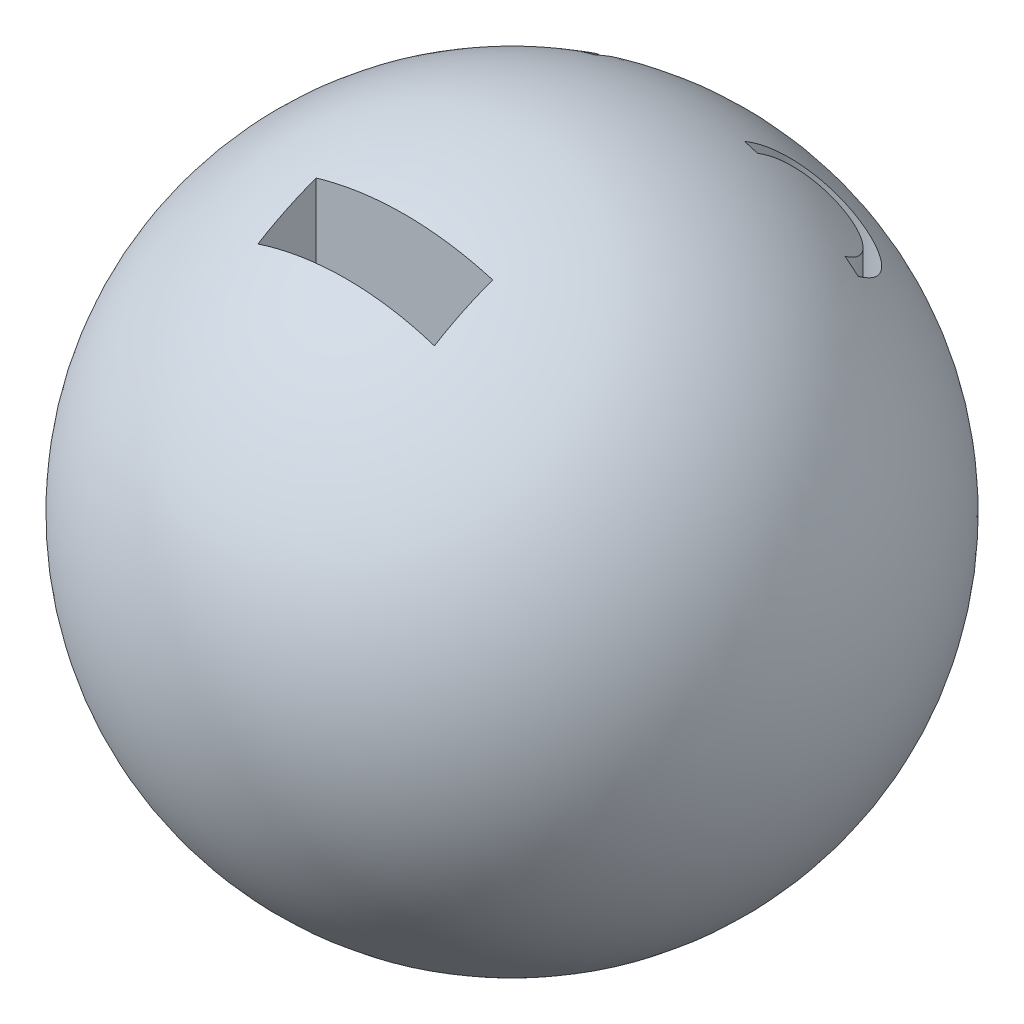
ISO-10303-21;
HEADER;
FILE_DESCRIPTION(('STEP AP214'),'2;1');
FILE_NAME('part.step','',(''),(''),'','','');
FILE_SCHEMA(('AUTOMOTIVE_DESIGN { 1 0 10303 214 1 1 1 1 }'));
ENDSEC;
DATA;
#1=APPLICATION_CONTEXT('core data for automotive mechanical design processes');
#2=APPLICATION_PROTOCOL_DEFINITION('international standard','automotive_design',2000,#1);
#3=PRODUCT_CONTEXT('',#1,'mechanical');
#4=PRODUCT('Part','Part','',(#3));
#5=PRODUCT_RELATED_PRODUCT_CATEGORY('part','',(#4));
#6=PRODUCT_DEFINITION_FORMATION('','',#4);
#7=PRODUCT_DEFINITION_CONTEXT('part definition',#1,'design');
#8=PRODUCT_DEFINITION('design','',#6,#7);
#9=PRODUCT_DEFINITION_SHAPE('','',#8);
#10=(LENGTH_UNIT() NAMED_UNIT(*) SI_UNIT(.MILLI.,.METRE.));
#11=(NAMED_UNIT(*) PLANE_ANGLE_UNIT() SI_UNIT($,.RADIAN.));
#12=(NAMED_UNIT(*) SI_UNIT($,.STERADIAN.) SOLID_ANGLE_UNIT());
#13=UNCERTAINTY_MEASURE_WITH_UNIT(LENGTH_MEASURE(1.E-05),#10,'distance_accuracy_value','');
#14=(GEOMETRIC_REPRESENTATION_CONTEXT(3) GLOBAL_UNCERTAINTY_ASSIGNED_CONTEXT((#13)) GLOBAL_UNIT_ASSIGNED_CONTEXT((#10,
#11,#12)) REPRESENTATION_CONTEXT('',''));
#15=CARTESIAN_POINT('',(0.,0.,0.));
#16=DIRECTION('',(0.,0.,1.));
#17=DIRECTION('',(1.,0.,0.));
#18=AXIS2_PLACEMENT_3D('',#15,#16,#17);
#19=CARTESIAN_POINT('',(0.,25.,-11.940688040506));
#20=DIRECTION('',(0.,0.,-1.));
#21=DIRECTION('',(-1.,0.,0.));
#22=AXIS2_PLACEMENT_3D('',#19,#20,#21);
#23=PLANE('',#22);
#24=CARTESIAN_POINT('',(0.,0.,-11.940688040506));
#25=DIRECTION('',(0.,0.,-1.));
#26=DIRECTION('',(-1.,0.,0.));
#27=AXIS2_PLACEMENT_3D('',#24,#25,#26);
#28=CIRCLE('',#27,21.9640608522039);
#29=CARTESIAN_POINT('',(-14.3088925597589,16.663599936166,-11.940688040506));
#30=VERTEX_POINT('',#29);
#31=CARTESIAN_POINT('',(-13.3088925597589,17.4726457055625,-11.940688040506));
#32=VERTEX_POINT('',#31);
#33=EDGE_CURVE('E248',#30,#32,#28,.T.);
#34=ORIENTED_EDGE('',*,*,#33,.T.);
#35=DIRECTION('',(0.,-1.,0.));
#36=VECTOR('',#35,1.);
#37=CARTESIAN_POINT('',(-13.3088925597589,25.,-11.940688040506));
#38=LINE('',#37,#36);
#39=CARTESIAN_POINT('',(-13.3088925597589,10.,-11.940688040506));
#40=VERTEX_POINT('',#39);
#41=EDGE_CURVE('E212',#32,#40,#38,.T.);
#42=ORIENTED_EDGE('',*,*,#41,.T.);
#43=DIRECTION('',(1.,0.,0.));
#44=VECTOR('',#43,1.);
#45=CARTESIAN_POINT('',(0.,10.,-11.940688040506));
#46=LINE('',#45,#44);
#47=CARTESIAN_POINT('',(-14.3088925597589,10.,-11.940688040506));
#48=VERTEX_POINT('',#47);
#49=EDGE_CURVE('E155',#48,#40,#46,.T.);
#50=ORIENTED_EDGE('',*,*,#49,.F.);
#51=DIRECTION('',(0.,-1.,0.));
#52=VECTOR('',#51,1.);
#53=CARTESIAN_POINT('',(-14.3088925597589,25.,-11.940688040506));
#54=LINE('',#53,#52);
#55=EDGE_CURVE('E203',#30,#48,#54,.T.);
#56=ORIENTED_EDGE('',*,*,#55,.F.);
#57=EDGE_LOOP('',(#34,#42,#50,#56));
#58=FACE_BOUND('',#57,.T.);
#59=ADVANCED_FACE('F41',(#58),#23,.T.);
#60=CARTESIAN_POINT('',(-10.,25.,-11.940688040506));
#61=DIRECTION('',(0.,-1.,0.));
#62=DIRECTION('',(0.,0.,-1.));
#63=AXIS2_PLACEMENT_3D('',#60,#61,#62);
#64=CYLINDRICAL_SURFACE('',#63,3.3088925597589);
#65=CARTESIAN_POINT('',(-13.3088925537146,17.4727823871361,-11.9404880405061));
#66=CARTESIAN_POINT('',(-13.3088947361778,17.3562982098298,-12.1110222158404));
#67=CARTESIAN_POINT('',(-13.295704320917,17.2435619511227,-12.2852437985623));
#68=CARTESIAN_POINT('',(-13.2394840224336,17.0302466642146,-12.6384360645772));
#69=CARTESIAN_POINT('',(-13.1961747792395,16.9297918919905,-12.8174359969134));
#70=CARTESIAN_POINT('',(-13.0895534966639,16.7684106575193,-13.1343223187967));
#71=CARTESIAN_POINT('',(-13.0328757781544,16.7036676011026,-13.2724558375451));
#72=CARTESIAN_POINT('',(-12.8982481827764,16.5894970095622,-13.5443672620063));
#73=CARTESIAN_POINT('',(-12.8203655096168,16.540022125232,-13.6781574582544));
#74=CARTESIAN_POINT('',(-12.6872575039146,16.4797090616698,-13.872974060352));
#75=CARTESIAN_POINT('',(-12.6398543961017,16.4618596597068,-13.9372865489046));
#76=CARTESIAN_POINT('',(-12.5398587387273,16.4313683313452,-14.0630277135499));
#77=CARTESIAN_POINT('',(-12.4872689564581,16.4187236464608,-14.1244579019176));
#78=CARTESIAN_POINT('',(-12.3772270928151,16.3989696794622,-14.2437609526624));
#79=CARTESIAN_POINT('',(-12.3197750137572,16.3918603947113,-14.301633816734));
#80=CARTESIAN_POINT('',(-12.2005439741761,16.3833642470615,-14.4131464612956));
#81=CARTESIAN_POINT('',(-12.1387656725367,16.3819765146893,-14.4667868837516));
#82=CARTESIAN_POINT('',(-11.966448721888,16.3860567160445,-14.6055012122972));
#83=CARTESIAN_POINT('',(-11.8522803651384,16.3970570341724,-14.6860278827862));
#84=CARTESIAN_POINT('',(-11.6167880604062,16.4350539299512,-14.8310064694556));
#85=CARTESIAN_POINT('',(-11.4954639585343,16.4620508517337,-14.8954580397735));
#86=CARTESIAN_POINT('',(-11.2494767139356,16.5300110605877,-15.0075773367666));
#87=CARTESIAN_POINT('',(-11.1248218267965,16.5709423209933,-15.0552830458999));
#88=CARTESIAN_POINT('',(-10.8748148231284,16.6644368375098,-15.1345423843198));
#89=CARTESIAN_POINT('',(-10.7494623991202,16.7170056982645,-15.1660882066973));
#90=CARTESIAN_POINT('',(-10.4399301862444,16.8591669441455,-15.2256004361577));
#91=CARTESIAN_POINT('',(-10.2565690905799,16.9543803913237,-15.244484726608));
#92=CARTESIAN_POINT('',(-9.89726165829825,17.1591556451927,-15.2528883755337));
#93=CARTESIAN_POINT('',(-9.72133400780289,17.2687510622635,-15.2423377372067));
#94=CARTESIAN_POINT('',(-9.32622319277673,17.5332646935089,-15.1881463828031));
#95=CARTESIAN_POINT('',(-9.11064749460463,17.6916628954194,-15.1352175041833));
#96=CARTESIAN_POINT('',(-8.70038824613922,18.0176024646388,-14.9914380255558));
#97=CARTESIAN_POINT('',(-8.50571326598141,18.1851475403785,-14.9005719438615));
#98=CARTESIAN_POINT('',(-8.1370950222696,18.5269879186247,-14.6838168391881));
#99=CARTESIAN_POINT('',(-7.96351915513039,18.7013475551907,-14.5574076527589));
#100=CARTESIAN_POINT('',(-7.64365810131562,19.0503793758628,-14.2735328762265));
#101=CARTESIAN_POINT('',(-7.49739928543092,19.2250516993152,-14.1160375753453));
#102=CARTESIAN_POINT('',(-7.29400652147932,19.4944142931375,-13.8487971659073));
#103=CARTESIAN_POINT('',(-7.22598081294592,19.5904661858287,-13.7485502114371));
#104=CARTESIAN_POINT('',(-7.10066620453465,19.7806874260756,-13.5398987832321));
#105=CARTESIAN_POINT('',(-7.04338003311252,19.8748562898206,-13.4314922462749));
#106=CARTESIAN_POINT('',(-6.88942594455563,20.1528888251704,-13.0954685826447));
#107=CARTESIAN_POINT('',(-6.81001689165659,20.3331239359121,-12.8562119637034));
#108=CARTESIAN_POINT('',(-6.73662317202196,20.5772588165031,-12.4984695645343));
#109=CARTESIAN_POINT('',(-6.71976261581063,20.6486425030631,-12.3893366739656));
#110=CARTESIAN_POINT('',(-6.69700991229434,20.7874992694493,-12.1674621792254));
#111=CARTESIAN_POINT('',(-6.69112126007247,20.8549710965296,-12.0547194367704));
#112=CARTESIAN_POINT('',(-6.69110744628541,20.9201774967804,-11.940488040506));
#113=B_SPLINE_CURVE_WITH_KNOTS('',3,(#65,#66,#67,#68,#69,#70,#71,#72,#73,#74,#75,#76,#77,#78,
#79,#80,#81,#82,#83,#84,#85,#86,#87,#88,#89,#90,#91,#92,#93,#94,#95,#96,#97,#98,#99,#100,#101,
#102,#103,#104,#105,#106,#107,#108,#109,#110,#111,#112),.UNSPECIFIED.,.F.,.F.,(4,2,2,2,2,2,2,2,
2,2,2,2,2,2,2,2,2,2,2,2,2,2,2,4),(0.,0.620581022945615,1.24699623056297,1.73340283671913,
2.21828549261167,2.46355776347541,2.7086998727995,2.9538418653585,3.19894660364176,
3.61711164635238,4.03528568528253,4.45250501081032,4.86992570710641,5.48888661845468,
6.10932068400792,6.9231218757535,7.73725549445044,8.56398640652153,9.39151133252363,
9.85476913465211,10.3181444716936,11.2408903894361,11.6349047379844,12.0290445777515),.UNSPECIFIED.);
#114=CARTESIAN_POINT('',(-6.69110744024109,20.9200633446093,-11.940688040506));
#115=VERTEX_POINT('',#114);
#116=EDGE_CURVE('E241',#32,#115,#113,.T.);
#117=ORIENTED_EDGE('',*,*,#116,.T.);
#118=DIRECTION('',(0.,-1.,0.));
#119=VECTOR('',#118,1.);
#120=CARTESIAN_POINT('',(-6.69110744024109,25.,-11.940688040506));
#121=LINE('',#120,#119);
#122=CARTESIAN_POINT('',(-6.69110744024109,10.,-11.940688040506));
#123=VERTEX_POINT('',#122);
#124=EDGE_CURVE('E209',#115,#123,#121,.T.);
#125=ORIENTED_EDGE('',*,*,#124,.T.);
#126=CARTESIAN_POINT('',(-10.,10.,-11.940688040506));
#127=DIRECTION('',(0.,1.,0.));
#128=DIRECTION('',(0.,0.,1.));
#129=AXIS2_PLACEMENT_3D('',#126,#127,#128);
#130=CIRCLE('',#129,3.3088925597589);
#131=EDGE_CURVE('E161',#40,#123,#130,.F.);
#132=ORIENTED_EDGE('',*,*,#131,.F.);
#133=ORIENTED_EDGE('',*,*,#41,.F.);
#134=EDGE_LOOP('',(#117,#125,#132,#133));
#135=FACE_BOUND('',#134,.T.);
#136=ADVANCED_FACE('F236',(#135),#64,.T.);
#137=CARTESIAN_POINT('',(0.,25.,-11.940688040506));
#138=DIRECTION('',(0.,0.,1.));
#139=DIRECTION('',(1.,0.,0.));
#140=AXIS2_PLACEMENT_3D('',#137,#138,#139);
#141=PLANE('',#140);
#142=DIRECTION('',(0.,-1.,0.));
#143=VECTOR('',#142,1.);
#144=CARTESIAN_POINT('',(-5.69110744024109,25.,-11.940688040506));
#145=LINE('',#144,#143);
#146=CARTESIAN_POINT('',(-5.69110744024109,21.2139403511688,-11.940688040506));
#147=VERTEX_POINT('',#146);
#148=CARTESIAN_POINT('',(-5.69110744024109,10.,-11.940688040506));
#149=VERTEX_POINT('',#148);
#150=EDGE_CURVE('E206',#147,#149,#145,.T.);
#151=ORIENTED_EDGE('',*,*,#150,.T.);
#152=DIRECTION('',(-1.,0.,0.));
#153=VECTOR('',#152,1.);
#154=CARTESIAN_POINT('',(0.,10.,-11.940688040506));
#155=LINE('',#154,#153);
#156=EDGE_CURVE('E195',#149,#123,#155,.T.);
#157=ORIENTED_EDGE('',*,*,#156,.T.);
#158=ORIENTED_EDGE('',*,*,#124,.F.);
#159=CARTESIAN_POINT('',(0.,0.,-11.940688040506));
#160=DIRECTION('',(0.,0.,1.));
#161=DIRECTION('',(1.,0.,0.));
#162=AXIS2_PLACEMENT_3D('',#159,#160,#161);
#163=CIRCLE('',#162,21.9640608522039);
#164=EDGE_CURVE('E223',#147,#115,#163,.T.);
#165=ORIENTED_EDGE('',*,*,#164,.F.);
#166=EDGE_LOOP('',(#151,#157,#158,#165));
#167=FACE_BOUND('',#166,.T.);
#168=ADVANCED_FACE('F231',(#167),#141,.F.);
#169=CARTESIAN_POINT('',(-10.,25.,-11.940688040506));
#170=DIRECTION('',(0.,-1.,0.));
#171=DIRECTION('',(0.,0.,-1.));
#172=AXIS2_PLACEMENT_3D('',#169,#170,#171);
#173=CYLINDRICAL_SURFACE('',#172,4.30889255975891);
#174=CARTESIAN_POINT('',(-5.69110744488266,21.214052922658,-11.940488040506));
#175=CARTESIAN_POINT('',(-5.69112160580676,21.1232128573604,-12.1018718422695));
#176=CARTESIAN_POINT('',(-5.7001573811218,21.0288061804851,-12.2609835644087));
#177=CARTESIAN_POINT('',(-5.73490808118444,20.8340108438783,-12.5733440622445));
#178=CARTESIAN_POINT('',(-5.76060009682489,20.7336305722401,-12.7266005850922));
#179=CARTESIAN_POINT('',(-5.86011492535645,20.4265428693245,-13.1738220832015));
#180=CARTESIAN_POINT('',(-5.95642281529891,20.2123724134185,-13.457907133213));
#181=CARTESIAN_POINT('',(-6.18550474194812,19.7969859531686,-13.9615478196891));
#182=CARTESIAN_POINT('',(-6.31285192974821,19.5970876244117,-14.1847677378886));
#183=CARTESIAN_POINT('',(-6.60189318072495,19.1910110170432,-14.6022564661009));
#184=CARTESIAN_POINT('',(-6.76365449011399,18.9848211302065,-14.796467308189));
#185=CARTESIAN_POINT('',(-7.15130407535014,18.5297514148325,-15.1874417264897));
#186=CARTESIAN_POINT('',(-7.38354576153136,18.280374549844,-15.3773432086696));
#187=CARTESIAN_POINT('',(-7.88461016466431,17.784520315667,-15.7065235545689));
#188=CARTESIAN_POINT('',(-8.15343272312807,17.5380429339214,-15.8458026376021));
#189=CARTESIAN_POINT('',(-8.55794707478728,17.1955710091532,-16.0031535784751));
#190=CARTESIAN_POINT('',(-8.6808635537406,17.0948776487073,-16.0447711963731));
#191=CARTESIAN_POINT('',(-8.93198980075096,16.8962530153711,-16.1171695549907));
#192=CARTESIAN_POINT('',(-9.06019972296271,16.7983218230601,-16.1479499798626));
#193=CARTESIAN_POINT('',(-9.45195331966465,16.510216544598,-16.222837939047));
#194=CARTESIAN_POINT('',(-9.72316146283604,16.3252678679447,-16.2497079256628));
#195=CARTESIAN_POINT('',(-10.2029206364221,16.0284298869716,-16.2494880558523));
#196=CARTESIAN_POINT('',(-10.4078146911034,15.9105628609248,-16.2353733462315));
#197=CARTESIAN_POINT('',(-10.82274531702,15.6932353025385,-16.175477674991));
#198=CARTESIAN_POINT('',(-11.0327738267289,15.5937477811044,-16.1297436202794));
#199=CARTESIAN_POINT('',(-11.4108423953104,15.4376641308241,-16.0158286120584));
#200=CARTESIAN_POINT('',(-11.578845660906,15.3764668393038,-15.9539986273912));
#201=CARTESIAN_POINT('',(-11.8276994040755,15.2999426124301,-15.8438060236446));
#202=CARTESIAN_POINT('',(-11.910139402595,15.2769771794901,-15.8041588762536));
#203=CARTESIAN_POINT('',(-12.0733552438296,15.2365888141592,-15.7190750141773));
#204=CARTESIAN_POINT('',(-12.1541317942374,15.2191634772602,-15.6736408232056));
#205=CARTESIAN_POINT('',(-12.3139039743118,15.1901473293927,-15.5767838516283));
#206=CARTESIAN_POINT('',(-12.3928831199409,15.1785983381788,-15.5253212678017));
#207=CARTESIAN_POINT('',(-12.5477000452489,15.1618112520408,-15.4169937278286));
#208=CARTESIAN_POINT('',(-12.6235392082053,15.156570348984,-15.3601311877195));
#209=CARTESIAN_POINT('',(-12.7714066085901,15.1525317663278,-15.2414219742566));
#210=CARTESIAN_POINT('',(-12.8434346654258,15.1537343917856,-15.1795750650635));
#211=CARTESIAN_POINT('',(-12.9830222278163,15.1625400323031,-15.051495531072));
#212=CARTESIAN_POINT('',(-13.0505819837297,15.1701426884418,-14.9852631524078));
#213=CARTESIAN_POINT('',(-13.2326044850222,15.2001307949331,-14.7947006988857));
#214=CARTESIAN_POINT('',(-13.3415788283919,15.2294669015372,-14.6661034298615));
#215=CARTESIAN_POINT('',(-13.5415089187139,15.3060336614409,-14.4007642827401));
#216=CARTESIAN_POINT('',(-13.6324623764455,15.3532665859839,-14.2640213727558));
#217=CARTESIAN_POINT('',(-13.8242670766582,15.4815721294379,-13.9378246249311));
#218=CARTESIAN_POINT('',(-13.9177584031864,15.5686962907881,-13.74642116062));
#219=CARTESIAN_POINT('',(-14.073512171116,15.7632286108588,-13.3607597195509));
#220=CARTESIAN_POINT('',(-14.1356609160322,15.8707087003341,-13.1664939443215));
#221=CARTESIAN_POINT('',(-14.2266719628105,16.0892861356101,-12.7976595922735));
#222=CARTESIAN_POINT('',(-14.2581036785969,16.1991051559526,-12.6229479939644));
#223=CARTESIAN_POINT('',(-14.2889124845589,16.3697085815464,-12.3640731982015));
#224=CARTESIAN_POINT('',(-14.2964610068188,16.4273006278777,-12.2786670473445));
#225=CARTESIAN_POINT('',(-14.3064492527117,16.5442576669149,-12.1088270492492));
#226=CARTESIAN_POINT('',(-14.3088912064843,16.6036218741893,-12.0243927935937));
#227=CARTESIAN_POINT('',(-14.3088925551173,16.6637432529621,-11.9404880405061));
#228=B_SPLINE_CURVE_WITH_KNOTS('',3,(#174,#175,#176,#177,#178,#179,#180,#181,#182,#183,#184,
#185,#186,#187,#188,#189,#190,#191,#192,#193,#194,#195,#196,#197,#198,#199,#200,#201,#202,#203,
#204,#205,#206,#207,#208,#209,#210,#211,#212,#213,#214,#215,#216,#217,#218,#219,#220,#221,#222,
#223,#224,#225,#226,#227),.UNSPECIFIED.,.F.,.F.,(4,2,2,2,2,2,2,2,2,2,2,2,2,2,2,2,2,2,2,2,2,2,2,
2,2,2,4),(0.,0.554929415226456,1.10909719138026,2.20837827309978,3.18200109758884,
4.15754417669794,5.3229847609625,6.48842029607353,6.98078837257618,7.47317079786155,
8.45572671197011,9.16384845967077,9.87092196523365,10.436021950499,10.7186694342487,
11.0011940755557,11.285702163236,11.5700835513007,11.8544784029966,12.1388573065576,
12.6496779357525,13.1605634137255,13.8472098419082,14.5363295069621,15.1610021252548,
15.4707383001931,15.7803391789239),.UNSPECIFIED.);
#229=EDGE_CURVE('E215',#147,#30,#228,.T.);
#230=ORIENTED_EDGE('',*,*,#229,.T.);
#231=ORIENTED_EDGE('',*,*,#55,.T.);
#232=CARTESIAN_POINT('',(-10.,10.,-11.940688040506));
#233=DIRECTION('',(0.,1.,0.));
#234=DIRECTION('',(0.,0.,1.));
#235=AXIS2_PLACEMENT_3D('',#232,#233,#234);
#236=CIRCLE('',#235,4.30889255975891);
#237=EDGE_CURVE('E199',#149,#48,#236,.T.);
#238=ORIENTED_EDGE('',*,*,#237,.F.);
#239=ORIENTED_EDGE('',*,*,#150,.F.);
#240=EDGE_LOOP('',(#230,#231,#238,#239));
#241=FACE_BOUND('',#240,.T.);
#242=ADVANCED_FACE('F225',(#241),#173,.F.);
#243=CARTESIAN_POINT('',(0.,10.,0.));
#244=DIRECTION('',(0.,1.,0.));
#245=DIRECTION('',(0.,0.,1.));
#246=AXIS2_PLACEMENT_3D('',#243,#244,#245);
#247=PLANE('',#246);
#248=ORIENTED_EDGE('',*,*,#49,.T.);
#249=ORIENTED_EDGE('',*,*,#131,.T.);
#250=ORIENTED_EDGE('',*,*,#156,.F.);
#251=ORIENTED_EDGE('',*,*,#237,.T.);
#252=EDGE_LOOP('',(#248,#249,#250,#251));
#253=FACE_BOUND('',#252,.T.);
#254=ADVANCED_FACE('F230',(#253),#247,.T.);
#255=CARTESIAN_POINT('',(0.,0.,0.));
#256=DIRECTION('',(0.,-1.,0.));
#257=DIRECTION('',(0.,0.,1.));
#258=AXIS2_PLACEMENT_3D('',#255,#256,#257);
#259=SPHERICAL_SURFACE('',#258,25.);
#260=ORIENTED_EDGE('',*,*,#33,.F.);
#261=ORIENTED_EDGE('',*,*,#229,.F.);
#262=ORIENTED_EDGE('',*,*,#164,.T.);
#263=ORIENTED_EDGE('',*,*,#116,.F.);
#264=EDGE_LOOP('',(#260,#261,#262,#263));
#265=FACE_BOUND('',#264,.T.);
#266=CARTESIAN_POINT('',(0.,0.,8.15517291114531));
#267=DIRECTION('',(0.,0.,-1.));
#268=DIRECTION('',(-1.,0.,0.));
#269=AXIS2_PLACEMENT_3D('',#266,#267,#268);
#270=CIRCLE('',#269,23.6324597701831);
#271=CARTESIAN_POINT('',(-6.69110744024109,22.6654414475534,8.15517291114531));
#272=VERTEX_POINT('',#271);
#273=CARTESIAN_POINT('',(6.69110744024109,22.6654414475534,8.15517291114531));
#274=VERTEX_POINT('',#273);
#275=EDGE_CURVE('E256',#272,#274,#270,.T.);
#276=ORIENTED_EDGE('',*,*,#275,.T.);
#277=CARTESIAN_POINT('',(6.69110744024109,0.,0.));
#278=DIRECTION('',(1.,0.,0.));
#279=DIRECTION('',(0.,0.,-1.));
#280=AXIS2_PLACEMENT_3D('',#277,#278,#279);
#281=CIRCLE('',#280,24.0879447280824);
#282=CARTESIAN_POINT('',(6.69110744024109,20.5459200953552,12.5735535413991));
#283=VERTEX_POINT('',#282);
#284=EDGE_CURVE('E260',#274,#283,#281,.T.);
#285=ORIENTED_EDGE('',*,*,#284,.T.);
#286=CARTESIAN_POINT('',(0.,0.,12.5735535413991));
#287=DIRECTION('',(0.,0.,-1.));
#288=DIRECTION('',(-1.,0.,0.));
#289=AXIS2_PLACEMENT_3D('',#286,#287,#288);
#290=CIRCLE('',#289,21.608002021047);
#291=CARTESIAN_POINT('',(-6.69110744024109,20.5459200953552,12.5735535413991));
#292=VERTEX_POINT('',#291);
#293=EDGE_CURVE('E134',#292,#283,#290,.T.);
#294=ORIENTED_EDGE('',*,*,#293,.F.);
#295=CARTESIAN_POINT('',(-6.69110744024109,0.,0.));
#296=DIRECTION('',(1.,0.,0.));
#297=DIRECTION('',(0.,0.,-1.));
#298=AXIS2_PLACEMENT_3D('',#295,#296,#297);
#299=CIRCLE('',#298,24.0879447280824);
#300=EDGE_CURVE('E253',#272,#292,#299,.T.);
#301=ORIENTED_EDGE('',*,*,#300,.F.);
#302=EDGE_LOOP('',(#276,#285,#294,#301));
#303=FACE_BOUND('',#302,.T.);
#304=CARTESIAN_POINT('',(0.,0.,-11.940688040506));
#305=DIRECTION('',(0.,0.,-1.));
#306=DIRECTION('',(-1.,0.,0.));
#307=AXIS2_PLACEMENT_3D('',#304,#305,#306);
#308=CIRCLE('',#307,21.9640608522039);
#309=CARTESIAN_POINT('',(5.69110744024109,21.2139403511688,-11.940688040506));
#310=VERTEX_POINT('',#309);
#311=CARTESIAN_POINT('',(6.6911074402411,20.9200633446088,-11.940688040506));
#312=VERTEX_POINT('',#311);
#313=EDGE_CURVE('E11',#310,#312,#308,.T.);
#314=ORIENTED_EDGE('',*,*,#313,.F.);
#315=CARTESIAN_POINT('',(5.69110744488266,21.214052922658,-11.940488040506));
#316=CARTESIAN_POINT('',(5.69112160580676,21.1232128573604,-12.1018718422695));
#317=CARTESIAN_POINT('',(5.7001573811218,21.0288061804851,-12.2609835644087));
#318=CARTESIAN_POINT('',(5.73490808118444,20.8340108438783,-12.5733440622445));
#319=CARTESIAN_POINT('',(5.76060009682489,20.7336305722401,-12.7266005850922));
#320=CARTESIAN_POINT('',(5.86011492535645,20.4265428693245,-13.1738220832015));
#321=CARTESIAN_POINT('',(5.95642281529891,20.2123724134185,-13.457907133213));
#322=CARTESIAN_POINT('',(6.18550474194812,19.7969859531686,-13.9615478196891));
#323=CARTESIAN_POINT('',(6.31285192974821,19.5970876244117,-14.1847677378886));
#324=CARTESIAN_POINT('',(6.60189318072495,19.1910110170432,-14.6022564661009));
#325=CARTESIAN_POINT('',(6.76365449011399,18.9848211302065,-14.796467308189));
#326=CARTESIAN_POINT('',(7.15130407535014,18.5297514148325,-15.1874417264897));
#327=CARTESIAN_POINT('',(7.38354576153136,18.280374549844,-15.3773432086696));
#328=CARTESIAN_POINT('',(7.88461016466431,17.784520315667,-15.7065235545689));
#329=CARTESIAN_POINT('',(8.15343272312807,17.5380429339214,-15.8458026376021));
#330=CARTESIAN_POINT('',(8.55794707478728,17.1955710091532,-16.0031535784751));
#331=CARTESIAN_POINT('',(8.6808635537406,17.0948776487073,-16.0447711963731));
#332=CARTESIAN_POINT('',(8.93198980075096,16.8962530153711,-16.1171695549907));
#333=CARTESIAN_POINT('',(9.06019972296271,16.7983218230601,-16.1479499798626));
#334=CARTESIAN_POINT('',(9.45195331966465,16.510216544598,-16.222837939047));
#335=CARTESIAN_POINT('',(9.72316146283604,16.3252678679447,-16.2497079256628));
#336=CARTESIAN_POINT('',(10.2029206364221,16.0284298869716,-16.2494880558523));
#337=CARTESIAN_POINT('',(10.4078146911034,15.9105628609248,-16.2353733462315));
#338=CARTESIAN_POINT('',(10.82274531702,15.6932353025385,-16.175477674991));
#339=CARTESIAN_POINT('',(11.0327738267289,15.5937477811044,-16.1297436202794));
#340=CARTESIAN_POINT('',(11.4108423953104,15.4376641308241,-16.0158286120584));
#341=CARTESIAN_POINT('',(11.578845660906,15.3764668393038,-15.9539986273912));
#342=CARTESIAN_POINT('',(11.8276994040755,15.2999426124301,-15.8438060236446));
#343=CARTESIAN_POINT('',(11.910139402595,15.2769771794901,-15.8041588762536));
#344=CARTESIAN_POINT('',(12.0733552438296,15.2365888141592,-15.7190750141773));
#345=CARTESIAN_POINT('',(12.1541317942374,15.2191634772602,-15.6736408232056));
#346=CARTESIAN_POINT('',(12.3139039743118,15.1901473293927,-15.5767838516283));
#347=CARTESIAN_POINT('',(12.3928831199409,15.1785983381788,-15.5253212678017));
#348=CARTESIAN_POINT('',(12.5477000452489,15.1618112520408,-15.4169937278286));
#349=CARTESIAN_POINT('',(12.6235392082053,15.156570348984,-15.3601311877195));
#350=CARTESIAN_POINT('',(12.7714066085901,15.1525317663278,-15.2414219742566));
#351=CARTESIAN_POINT('',(12.8434346654258,15.1537343917856,-15.1795750650635));
#352=CARTESIAN_POINT('',(12.9830222278163,15.1625400323031,-15.051495531072));
#353=CARTESIAN_POINT('',(13.0505819837297,15.1701426884418,-14.9852631524078));
#354=CARTESIAN_POINT('',(13.2326044850222,15.2001307949331,-14.7947006988857));
#355=CARTESIAN_POINT('',(13.3415788283919,15.2294669015372,-14.6661034298615));
#356=CARTESIAN_POINT('',(13.5415089187139,15.3060336614409,-14.4007642827401));
#357=CARTESIAN_POINT('',(13.6324623764455,15.3532665859839,-14.2640213727558));
#358=CARTESIAN_POINT('',(13.8242670766582,15.4815721294379,-13.9378246249311));
#359=CARTESIAN_POINT('',(13.9177584031864,15.5686962907881,-13.74642116062));
#360=CARTESIAN_POINT('',(14.073512171116,15.7632286108588,-13.3607597195509));
#361=CARTESIAN_POINT('',(14.1356609160322,15.8707087003341,-13.1664939443215));
#362=CARTESIAN_POINT('',(14.2266719628105,16.0892861356101,-12.7976595922735));
#363=CARTESIAN_POINT('',(14.2581036785969,16.1991051559526,-12.6229479939644));
#364=CARTESIAN_POINT('',(14.2889124845589,16.3697085815464,-12.3640731982015));
#365=CARTESIAN_POINT('',(14.2964610068188,16.4273006278777,-12.2786670473445));
#366=CARTESIAN_POINT('',(14.3064492527117,16.5442576669149,-12.1088270492492));
#367=CARTESIAN_POINT('',(14.3088912064843,16.6036218741893,-12.0243927935937));
#368=CARTESIAN_POINT('',(14.3088925551173,16.6637432529621,-11.9404880405061));
#369=B_SPLINE_CURVE_WITH_KNOTS('',3,(#315,#316,#317,#318,#319,#320,#321,#322,#323,#324,#325,
#326,#327,#328,#329,#330,#331,#332,#333,#334,#335,#336,#337,#338,#339,#340,#341,#342,#343,#344,
#345,#346,#347,#348,#349,#350,#351,#352,#353,#354,#355,#356,#357,#358,#359,#360,#361,#362,#363,
#364,#365,#366,#367,#368),.UNSPECIFIED.,.F.,.F.,(4,2,2,2,2,2,2,2,2,2,2,2,2,2,2,2,2,2,2,2,2,2,2,
2,2,2,4),(0.,0.554929415226456,1.10909719138026,2.20837827309978,3.18200109758884,
4.15754417669794,5.3229847609625,6.48842029607353,6.98078837257618,7.47317079786155,
8.45572671197011,9.16384845967077,9.87092196523365,10.436021950499,10.7186694342487,
11.0011940755557,11.285702163236,11.5700835513007,11.8544784029966,12.1388573065576,
12.6496779357525,13.1605634137255,13.8472098419082,14.5363295069621,15.1610021252548,
15.4707383001931,15.7803391789239),.UNSPECIFIED.);
#370=CARTESIAN_POINT('',(14.3088925597589,16.663599936166,-11.940688040506));
#371=VERTEX_POINT('',#370);
#372=EDGE_CURVE('E263',#310,#371,#369,.T.);
#373=ORIENTED_EDGE('',*,*,#372,.T.);
#374=CARTESIAN_POINT('',(0.,0.,-11.940688040506));
#375=DIRECTION('',(0.,0.,1.));
#376=DIRECTION('',(1.,0.,0.));
#377=AXIS2_PLACEMENT_3D('',#374,#375,#376);
#378=CIRCLE('',#377,21.9640608522039);
#379=CARTESIAN_POINT('',(13.3088925597589,17.4726457055625,-11.940688040506));
#380=VERTEX_POINT('',#379);
#381=EDGE_CURVE('E272',#371,#380,#378,.T.);
#382=ORIENTED_EDGE('',*,*,#381,.T.);
#383=CARTESIAN_POINT('',(13.3088925537146,17.4727823871361,-11.9404880405061));
#384=CARTESIAN_POINT('',(13.3088947361778,17.3562982098298,-12.1110222158404));
#385=CARTESIAN_POINT('',(13.295704320917,17.2435619511227,-12.2852437985623));
#386=CARTESIAN_POINT('',(13.2394840224336,17.0302466642146,-12.6384360645772));
#387=CARTESIAN_POINT('',(13.1961747792395,16.9297918919905,-12.8174359969134));
#388=CARTESIAN_POINT('',(13.0895534966639,16.7684106575193,-13.1343223187967));
#389=CARTESIAN_POINT('',(13.0328757781544,16.7036676011026,-13.2724558375451));
#390=CARTESIAN_POINT('',(12.8982481827764,16.5894970095622,-13.5443672620063));
#391=CARTESIAN_POINT('',(12.8203655096168,16.540022125232,-13.6781574582544));
#392=CARTESIAN_POINT('',(12.6872575039146,16.4797090616698,-13.872974060352));
#393=CARTESIAN_POINT('',(12.6398543961017,16.4618596597068,-13.9372865489046));
#394=CARTESIAN_POINT('',(12.5398587387273,16.4313683313452,-14.0630277135499));
#395=CARTESIAN_POINT('',(12.4872689564581,16.4187236464608,-14.1244579019176));
#396=CARTESIAN_POINT('',(12.3772270928151,16.3989696794622,-14.2437609526624));
#397=CARTESIAN_POINT('',(12.3197750137572,16.3918603947113,-14.301633816734));
#398=CARTESIAN_POINT('',(12.2005439741761,16.3833642470615,-14.4131464612956));
#399=CARTESIAN_POINT('',(12.1387656725367,16.3819765146893,-14.4667868837516));
#400=CARTESIAN_POINT('',(11.966448721888,16.3860567160445,-14.6055012122972));
#401=CARTESIAN_POINT('',(11.8522803651384,16.3970570341724,-14.6860278827862));
#402=CARTESIAN_POINT('',(11.6167880604062,16.4350539299512,-14.8310064694556));
#403=CARTESIAN_POINT('',(11.4954639585343,16.4620508517337,-14.8954580397735));
#404=CARTESIAN_POINT('',(11.2494767139356,16.5300110605877,-15.0075773367666));
#405=CARTESIAN_POINT('',(11.1248218267965,16.5709423209933,-15.0552830458999));
#406=CARTESIAN_POINT('',(10.8748148231284,16.6644368375098,-15.1345423843198));
#407=CARTESIAN_POINT('',(10.7494623991202,16.7170056982645,-15.1660882066973));
#408=CARTESIAN_POINT('',(10.4399301862444,16.8591669441455,-15.2256004361577));
#409=CARTESIAN_POINT('',(10.2565690905799,16.9543803913237,-15.244484726608));
#410=CARTESIAN_POINT('',(9.89726165829825,17.1591556451927,-15.2528883755337));
#411=CARTESIAN_POINT('',(9.72133400780289,17.2687510622635,-15.2423377372067));
#412=CARTESIAN_POINT('',(9.32622319277673,17.5332646935089,-15.1881463828031));
#413=CARTESIAN_POINT('',(9.11064749460463,17.6916628954194,-15.1352175041833));
#414=CARTESIAN_POINT('',(8.70038824613922,18.0176024646388,-14.9914380255558));
#415=CARTESIAN_POINT('',(8.50571326598141,18.1851475403785,-14.9005719438615));
#416=CARTESIAN_POINT('',(8.1370950222696,18.5269879186247,-14.6838168391881));
#417=CARTESIAN_POINT('',(7.96351915513039,18.7013475551907,-14.5574076527589));
#418=CARTESIAN_POINT('',(7.64365810131562,19.0503793758628,-14.2735328762265));
#419=CARTESIAN_POINT('',(7.49739928543092,19.2250516993152,-14.1160375753453));
#420=CARTESIAN_POINT('',(7.29400652147932,19.4944142931375,-13.8487971659073));
#421=CARTESIAN_POINT('',(7.22598081294592,19.5904661858287,-13.7485502114371));
#422=CARTESIAN_POINT('',(7.10066620453465,19.7806874260756,-13.5398987832321));
#423=CARTESIAN_POINT('',(7.04338003311252,19.8748562898206,-13.4314922462749));
#424=CARTESIAN_POINT('',(6.88942594455563,20.1528888251704,-13.0954685826447));
#425=CARTESIAN_POINT('',(6.81001689165659,20.3331239359121,-12.8562119637034));
#426=CARTESIAN_POINT('',(6.73662317202196,20.5772588165031,-12.4984695645343));
#427=CARTESIAN_POINT('',(6.71976261581063,20.6486425030631,-12.3893366739656));
#428=CARTESIAN_POINT('',(6.69700991229434,20.7874992694493,-12.1674621792254));
#429=CARTESIAN_POINT('',(6.69112126007247,20.8549710965296,-12.0547194367704));
#430=CARTESIAN_POINT('',(6.69110744628541,20.9201774967804,-11.940488040506));
#431=B_SPLINE_CURVE_WITH_KNOTS('',3,(#383,#384,#385,#386,#387,#388,#389,#390,#391,#392,#393,
#394,#395,#396,#397,#398,#399,#400,#401,#402,#403,#404,#405,#406,#407,#408,#409,#410,#411,#412,
#413,#414,#415,#416,#417,#418,#419,#420,#421,#422,#423,#424,#425,#426,#427,#428,#429,#430),
.UNSPECIFIED.,.F.,.F.,(4,2,2,2,2,2,2,2,2,2,2,2,2,2,2,2,2,2,2,2,2,2,2,4),(0.,0.620581022945615,
1.24699623056297,1.73340283671913,2.21828549261167,2.46355776347541,2.7086998727995,
2.9538418653585,3.19894660364176,3.61711164635238,4.03528568528253,4.45250501081032,
4.86992570710641,5.48888661845468,6.10932068400792,6.9231218757535,7.73725549445044,
8.56398640652153,9.39151133252363,9.85476913465211,10.3181444716936,11.2408903894361,
11.6349047379844,12.0290445777515),.UNSPECIFIED.);
#432=EDGE_CURVE('E51',#380,#312,#431,.T.);
#433=ORIENTED_EDGE('',*,*,#432,.T.);
#434=EDGE_LOOP('',(#314,#373,#382,#433));
#435=FACE_BOUND('',#434,.T.);
#436=ADVANCED_FACE('F43',(#265,#303,#435),#259,.T.);
#437=CARTESIAN_POINT('',(6.6911074402411,25.,0.));
#438=DIRECTION('',(1.,0.,0.));
#439=DIRECTION('',(0.,0.,-1.));
#440=AXIS2_PLACEMENT_3D('',#437,#438,#439);
#441=PLANE('',#440);
#442=DIRECTION('',(0.,-1.,0.));
#443=VECTOR('',#442,1.);
#444=CARTESIAN_POINT('',(6.6911074402411,25.,8.15517291114531));
#445=LINE('',#444,#443);
#446=CARTESIAN_POINT('',(6.6911074402411,10.,8.15517291114531));
#447=VERTEX_POINT('',#446);
#448=EDGE_CURVE('E153',#274,#447,#445,.T.);
#449=ORIENTED_EDGE('',*,*,#448,.T.);
#450=DIRECTION('',(0.,0.,1.));
#451=VECTOR('',#450,1.);
#452=CARTESIAN_POINT('',(6.6911074402411,10.,0.));
#453=LINE('',#452,#451);
#454=CARTESIAN_POINT('',(6.6911074402411,10.,12.5735535413991));
#455=VERTEX_POINT('',#454);
#456=EDGE_CURVE('E145',#447,#455,#453,.T.);
#457=ORIENTED_EDGE('',*,*,#456,.T.);
#458=DIRECTION('',(0.,-1.,0.));
#459=VECTOR('',#458,1.);
#460=CARTESIAN_POINT('',(6.6911074402411,25.,12.5735535413991));
#461=LINE('',#460,#459);
#462=EDGE_CURVE('E129',#283,#455,#461,.T.);
#463=ORIENTED_EDGE('',*,*,#462,.F.);
#464=ORIENTED_EDGE('',*,*,#284,.F.);
#465=EDGE_LOOP('',(#449,#457,#463,#464));
#466=FACE_BOUND('',#465,.T.);
#467=ADVANCED_FACE('F151',(#466),#441,.F.);
#468=CARTESIAN_POINT('',(0.,25.,8.15517291114531));
#469=DIRECTION('',(0.,0.,-1.));
#470=DIRECTION('',(-1.,0.,0.));
#471=AXIS2_PLACEMENT_3D('',#468,#469,#470);
#472=PLANE('',#471);
#473=DIRECTION('',(0.,-1.,0.));
#474=VECTOR('',#473,1.);
#475=CARTESIAN_POINT('',(-6.6911074402411,25.,8.15517291114531));
#476=LINE('',#475,#474);
#477=CARTESIAN_POINT('',(-6.6911074402411,10.,8.15517291114531));
#478=VERTEX_POINT('',#477);
#479=EDGE_CURVE('E440',#272,#478,#476,.T.);
#480=ORIENTED_EDGE('',*,*,#479,.T.);
#481=DIRECTION('',(1.,0.,0.));
#482=VECTOR('',#481,1.);
#483=CARTESIAN_POINT('',(0.,10.,8.15517291114531));
#484=LINE('',#483,#482);
#485=EDGE_CURVE('E156',#478,#447,#484,.T.);
#486=ORIENTED_EDGE('',*,*,#485,.T.);
#487=ORIENTED_EDGE('',*,*,#448,.F.);
#488=ORIENTED_EDGE('',*,*,#275,.F.);
#489=EDGE_LOOP('',(#480,#486,#487,#488));
#490=FACE_BOUND('',#489,.T.);
#491=ADVANCED_FACE('F327',(#490),#472,.F.);
#492=CARTESIAN_POINT('',(-6.6911074402411,25.,0.));
#493=DIRECTION('',(1.,0.,0.));
#494=DIRECTION('',(0.,0.,-1.));
#495=AXIS2_PLACEMENT_3D('',#492,#493,#494);
#496=PLANE('',#495);
#497=ORIENTED_EDGE('',*,*,#300,.T.);
#498=DIRECTION('',(0.,-1.,0.));
#499=VECTOR('',#498,1.);
#500=CARTESIAN_POINT('',(-6.6911074402411,25.,12.5735535413991));
#501=LINE('',#500,#499);
#502=CARTESIAN_POINT('',(-6.6911074402411,10.,12.5735535413991));
#503=VERTEX_POINT('',#502);
#504=EDGE_CURVE('E66',#292,#503,#501,.T.);
#505=ORIENTED_EDGE('',*,*,#504,.T.);
#506=DIRECTION('',(0.,0.,1.));
#507=VECTOR('',#506,1.);
#508=CARTESIAN_POINT('',(-6.6911074402411,10.,0.));
#509=LINE('',#508,#507);
#510=EDGE_CURVE('E148',#478,#503,#509,.T.);
#511=ORIENTED_EDGE('',*,*,#510,.F.);
#512=ORIENTED_EDGE('',*,*,#479,.F.);
#513=EDGE_LOOP('',(#497,#505,#511,#512));
#514=FACE_BOUND('',#513,.T.);
#515=ADVANCED_FACE('F324',(#514),#496,.T.);
#516=CARTESIAN_POINT('',(0.,25.,12.5735535413991));
#517=DIRECTION('',(0.,0.,-1.));
#518=DIRECTION('',(-1.,0.,0.));
#519=AXIS2_PLACEMENT_3D('',#516,#517,#518);
#520=PLANE('',#519);
#521=ORIENTED_EDGE('',*,*,#293,.T.);
#522=ORIENTED_EDGE('',*,*,#462,.T.);
#523=DIRECTION('',(1.,0.,0.));
#524=VECTOR('',#523,1.);
#525=CARTESIAN_POINT('',(0.,10.,12.5735535413991));
#526=LINE('',#525,#524);
#527=EDGE_CURVE('E132',#503,#455,#526,.T.);
#528=ORIENTED_EDGE('',*,*,#527,.F.);
#529=ORIENTED_EDGE('',*,*,#504,.F.);
#530=EDGE_LOOP('',(#521,#522,#528,#529));
#531=FACE_BOUND('',#530,.T.);
#532=ADVANCED_FACE('F131',(#531),#520,.T.);
#533=CARTESIAN_POINT('',(0.,10.,0.));
#534=DIRECTION('',(0.,1.,0.));
#535=DIRECTION('',(0.,0.,1.));
#536=AXIS2_PLACEMENT_3D('',#533,#534,#535);
#537=PLANE('',#536);
#538=ORIENTED_EDGE('',*,*,#456,.F.);
#539=ORIENTED_EDGE('',*,*,#485,.F.);
#540=ORIENTED_EDGE('',*,*,#510,.T.);
#541=ORIENTED_EDGE('',*,*,#527,.T.);
#542=EDGE_LOOP('',(#538,#539,#540,#541));
#543=FACE_BOUND('',#542,.T.);
#544=ADVANCED_FACE('F143',(#543),#537,.T.);
#545=CARTESIAN_POINT('',(5.69110744024109,25.,-11.940688040506));
#546=DIRECTION('',(0.,0.,-1.));
#547=DIRECTION('',(-1.,0.,0.));
#548=AXIS2_PLACEMENT_3D('',#545,#546,#547);
#549=PLANE('',#548);
#550=ORIENTED_EDGE('',*,*,#313,.T.);
#551=DIRECTION('',(0.,-1.,0.));
#552=VECTOR('',#551,1.);
#553=CARTESIAN_POINT('',(6.6911074402411,25.,-11.940688040506));
#554=LINE('',#553,#552);
#555=CARTESIAN_POINT('',(6.6911074402411,10.,-11.940688040506));
#556=VERTEX_POINT('',#555);
#557=EDGE_CURVE('E166',#312,#556,#554,.T.);
#558=ORIENTED_EDGE('',*,*,#557,.T.);
#559=DIRECTION('',(1.,0.,0.));
#560=VECTOR('',#559,1.);
#561=CARTESIAN_POINT('',(5.69110744024109,10.,-11.940688040506));
#562=LINE('',#561,#560);
#563=CARTESIAN_POINT('',(5.69110744024109,10.,-11.940688040506));
#564=VERTEX_POINT('',#563);
#565=EDGE_CURVE('E188',#564,#556,#562,.T.);
#566=ORIENTED_EDGE('',*,*,#565,.F.);
#567=DIRECTION('',(0.,-1.,0.));
#568=VECTOR('',#567,1.);
#569=CARTESIAN_POINT('',(5.69110744024109,25.,-11.940688040506));
#570=LINE('',#569,#568);
#571=EDGE_CURVE('E174',#310,#564,#570,.T.);
#572=ORIENTED_EDGE('',*,*,#571,.F.);
#573=EDGE_LOOP('',(#550,#558,#566,#572));
#574=FACE_BOUND('',#573,.T.);
#575=ADVANCED_FACE('F315',(#574),#549,.T.);
#576=CARTESIAN_POINT('',(10.,25.,-11.940688040506));
#577=DIRECTION('',(0.,-1.,0.));
#578=DIRECTION('',(0.,0.,-1.));
#579=AXIS2_PLACEMENT_3D('',#576,#577,#578);
#580=CYLINDRICAL_SURFACE('',#579,3.3088925597589);
#581=DIRECTION('',(0.,-1.,0.));
#582=VECTOR('',#581,1.);
#583=CARTESIAN_POINT('',(13.3088925597589,25.,-11.940688040506));
#584=LINE('',#583,#582);
#585=CARTESIAN_POINT('',(13.3088925597589,10.,-11.940688040506));
#586=VERTEX_POINT('',#585);
#587=EDGE_CURVE('E169',#380,#586,#584,.T.);
#588=ORIENTED_EDGE('',*,*,#587,.T.);
#589=CARTESIAN_POINT('',(10.,10.,-11.940688040506));
#590=DIRECTION('',(0.,1.,0.));
#591=DIRECTION('',(0.,0.,1.));
#592=AXIS2_PLACEMENT_3D('',#589,#590,#591);
#593=CIRCLE('',#592,3.3088925597589);
#594=EDGE_CURVE('E184',#586,#556,#593,.T.);
#595=ORIENTED_EDGE('',*,*,#594,.T.);
#596=ORIENTED_EDGE('',*,*,#557,.F.);
#597=ORIENTED_EDGE('',*,*,#432,.F.);
#598=EDGE_LOOP('',(#588,#595,#596,#597));
#599=FACE_BOUND('',#598,.T.);
#600=ADVANCED_FACE('F311',(#599),#580,.T.);
#601=CARTESIAN_POINT('',(14.3088925597589,25.,-11.940688040506));
#602=DIRECTION('',(0.,0.,1.));
#603=DIRECTION('',(1.,0.,0.));
#604=AXIS2_PLACEMENT_3D('',#601,#602,#603);
#605=PLANE('',#604);
#606=DIRECTION('',(0.,-1.,0.));
#607=VECTOR('',#606,1.);
#608=CARTESIAN_POINT('',(14.3088925597589,25.,-11.940688040506));
#609=LINE('',#608,#607);
#610=CARTESIAN_POINT('',(14.3088925597589,10.,-11.940688040506));
#611=VERTEX_POINT('',#610);
#612=EDGE_CURVE('E58',#371,#611,#609,.T.);
#613=ORIENTED_EDGE('',*,*,#612,.T.);
#614=DIRECTION('',(-1.,0.,0.));
#615=VECTOR('',#614,1.);
#616=CARTESIAN_POINT('',(14.3088925597589,10.,-11.940688040506));
#617=LINE('',#616,#615);
#618=EDGE_CURVE('E180',#611,#586,#617,.T.);
#619=ORIENTED_EDGE('',*,*,#618,.T.);
#620=ORIENTED_EDGE('',*,*,#587,.F.);
#621=ORIENTED_EDGE('',*,*,#381,.F.);
#622=EDGE_LOOP('',(#613,#619,#620,#621));
#623=FACE_BOUND('',#622,.T.);
#624=ADVANCED_FACE('F278',(#623),#605,.F.);
#625=CARTESIAN_POINT('',(10.,25.,-11.940688040506));
#626=DIRECTION('',(0.,-1.,0.));
#627=DIRECTION('',(0.,0.,-1.));
#628=AXIS2_PLACEMENT_3D('',#625,#626,#627);
#629=CYLINDRICAL_SURFACE('',#628,4.30889255975891);
#630=ORIENTED_EDGE('',*,*,#571,.T.);
#631=CARTESIAN_POINT('',(10.,10.,-11.940688040506));
#632=DIRECTION('',(0.,-1.,0.));
#633=DIRECTION('',(0.,0.,-1.));
#634=AXIS2_PLACEMENT_3D('',#631,#632,#633);
#635=CIRCLE('',#634,4.30889255975891);
#636=EDGE_CURVE('E177',#564,#611,#635,.T.);
#637=ORIENTED_EDGE('',*,*,#636,.T.);
#638=ORIENTED_EDGE('',*,*,#612,.F.);
#639=ORIENTED_EDGE('',*,*,#372,.F.);
#640=EDGE_LOOP('',(#630,#637,#638,#639));
#641=FACE_BOUND('',#640,.T.);
#642=ADVANCED_FACE('F273',(#641),#629,.F.);
#643=CARTESIAN_POINT('',(10.,10.,-11.940688040506));
#644=DIRECTION('',(0.,1.,0.));
#645=DIRECTION('',(0.,0.,1.));
#646=AXIS2_PLACEMENT_3D('',#643,#644,#645);
#647=PLANE('',#646);
#648=ORIENTED_EDGE('',*,*,#565,.T.);
#649=ORIENTED_EDGE('',*,*,#594,.F.);
#650=ORIENTED_EDGE('',*,*,#618,.F.);
#651=ORIENTED_EDGE('',*,*,#636,.F.);
#652=EDGE_LOOP('',(#648,#649,#650,#651));
#653=FACE_BOUND('',#652,.T.);
#654=ADVANCED_FACE('F277',(#653),#647,.T.);
#655=CLOSED_SHELL('',(#59,#136,#168,#242,#254,#436,#467,#491,#515,#532,#544,#575,#600,#624,#642,#654));
#656=MANIFOLD_SOLID_BREP('B2',#655);
#657=ADVANCED_BREP_SHAPE_REPRESENTATION('',(#18,#656),#14);
#658=SHAPE_DEFINITION_REPRESENTATION(#9,#657);
ENDSEC;
END-ISO-10303-21;
